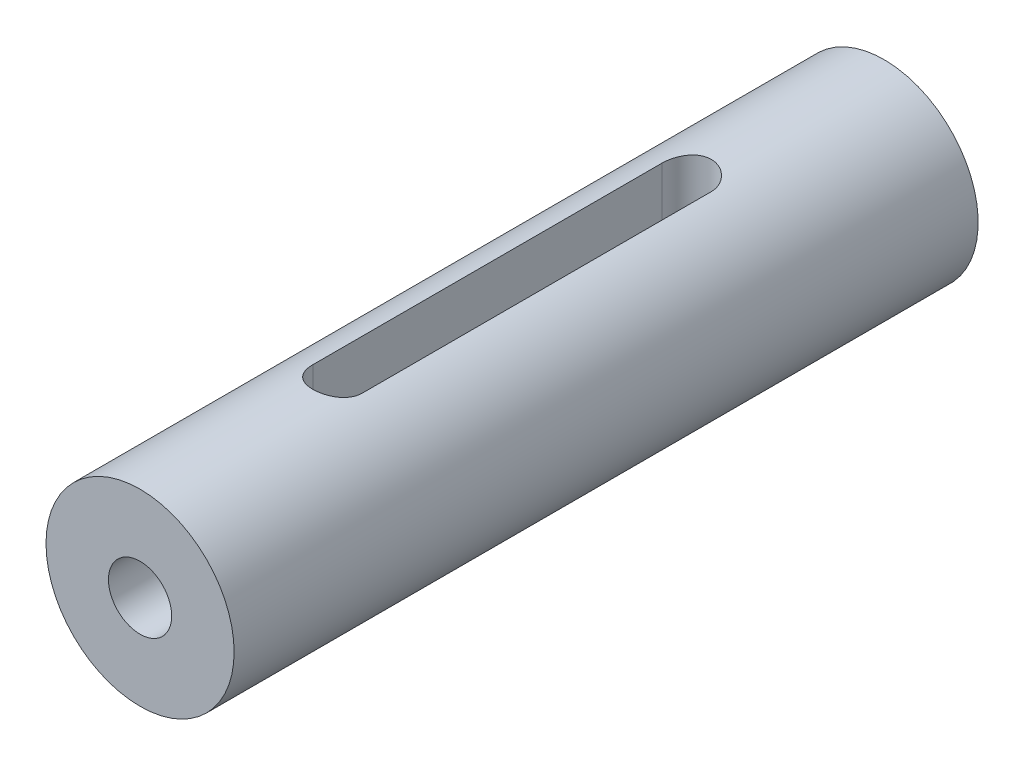
ISO-10303-21;
HEADER;
FILE_DESCRIPTION(('STEP AP214'),'2;1');
FILE_NAME('part.step','',(''),(''),'','','');
FILE_SCHEMA(('AUTOMOTIVE_DESIGN { 1 0 10303 214 1 1 1 1 }'));
ENDSEC;
DATA;
#1=APPLICATION_CONTEXT('core data for automotive mechanical design processes');
#2=APPLICATION_PROTOCOL_DEFINITION('international standard','automotive_design',2000,#1);
#3=PRODUCT_CONTEXT('',#1,'mechanical');
#4=PRODUCT('Part','Part','',(#3));
#5=PRODUCT_RELATED_PRODUCT_CATEGORY('part','',(#4));
#6=PRODUCT_DEFINITION_FORMATION('','',#4);
#7=PRODUCT_DEFINITION_CONTEXT('part definition',#1,'design');
#8=PRODUCT_DEFINITION('design','',#6,#7);
#9=PRODUCT_DEFINITION_SHAPE('','',#8);
#10=(LENGTH_UNIT() NAMED_UNIT(*) SI_UNIT(.MILLI.,.METRE.));
#11=(NAMED_UNIT(*) PLANE_ANGLE_UNIT() SI_UNIT($,.RADIAN.));
#12=(NAMED_UNIT(*) SI_UNIT($,.STERADIAN.) SOLID_ANGLE_UNIT());
#13=UNCERTAINTY_MEASURE_WITH_UNIT(LENGTH_MEASURE(1.E-05),#10,'distance_accuracy_value','');
#14=(GEOMETRIC_REPRESENTATION_CONTEXT(3) GLOBAL_UNCERTAINTY_ASSIGNED_CONTEXT((#13)) GLOBAL_UNIT_ASSIGNED_CONTEXT((#10,
#11,#12)) REPRESENTATION_CONTEXT('',''));
#15=CARTESIAN_POINT('',(0.,0.,0.));
#16=DIRECTION('',(0.,0.,1.));
#17=DIRECTION('',(1.,0.,0.));
#18=AXIS2_PLACEMENT_3D('',#15,#16,#17);
#19=CARTESIAN_POINT('',(1.25,-4.7625,8.836));
#20=DIRECTION('',(1.,0.,0.));
#21=DIRECTION('',(0.,0.,-1.));
#22=AXIS2_PLACEMENT_3D('',#19,#20,#21);
#23=PLANE('',#22);
#24=DIRECTION('',(0.,1.,0.));
#25=VECTOR('',#24,1.);
#26=CARTESIAN_POINT('',(1.25,-4.7625,8.836));
#27=LINE('',#26,#25);
#28=CARTESIAN_POINT('',(1.25,-4.5955311172921,8.836));
#29=VERTEX_POINT('',#28);
#30=CARTESIAN_POINT('',(1.25,-0.998749217771898,8.836));
#31=VERTEX_POINT('',#30);
#32=EDGE_CURVE('E109',#29,#31,#27,.T.);
#33=ORIENTED_EDGE('',*,*,#32,.T.);
#34=DIRECTION('',(0.,0.,-1.));
#35=VECTOR('',#34,1.);
#36=CARTESIAN_POINT('',(1.25,-0.998749217771898,-18.836));
#37=LINE('',#36,#35);
#38=CARTESIAN_POINT('',(1.25,-0.998749217771899,-8.836));
#39=VERTEX_POINT('',#38);
#40=EDGE_CURVE('E96',#31,#39,#37,.T.);
#41=ORIENTED_EDGE('',*,*,#40,.T.);
#42=DIRECTION('',(0.,1.,0.));
#43=VECTOR('',#42,1.);
#44=CARTESIAN_POINT('',(1.25,-4.7625,-8.836));
#45=LINE('',#44,#43);
#46=CARTESIAN_POINT('',(1.25,-4.5955311172921,-8.836));
#47=VERTEX_POINT('',#46);
#48=EDGE_CURVE('E106',#47,#39,#45,.T.);
#49=ORIENTED_EDGE('',*,*,#48,.F.);
#50=DIRECTION('',(0.,0.,-1.));
#51=VECTOR('',#50,1.);
#52=CARTESIAN_POINT('',(1.25,-4.5955311172921,22.9));
#53=LINE('',#52,#51);
#54=EDGE_CURVE('E102',#29,#47,#53,.T.);
#55=ORIENTED_EDGE('',*,*,#54,.F.);
#56=EDGE_LOOP('',(#33,#41,#49,#55));
#57=FACE_BOUND('',#56,.T.);
#58=ADVANCED_FACE('F26',(#57),#23,.F.);
#59=CARTESIAN_POINT('',(-1.25,-4.7625,8.836));
#60=DIRECTION('',(-1.,0.,0.));
#61=DIRECTION('',(0.,0.,1.));
#62=AXIS2_PLACEMENT_3D('',#59,#60,#61);
#63=PLANE('',#62);
#64=DIRECTION('',(0.,1.,0.));
#65=VECTOR('',#64,1.);
#66=CARTESIAN_POINT('',(-1.25,-4.7625,8.836));
#67=LINE('',#66,#65);
#68=CARTESIAN_POINT('',(-1.25,0.998749217771898,8.836));
#69=VERTEX_POINT('',#68);
#70=CARTESIAN_POINT('',(-1.25,4.5955311172921,8.836));
#71=VERTEX_POINT('',#70);
#72=EDGE_CURVE('E216',#69,#71,#67,.T.);
#73=ORIENTED_EDGE('',*,*,#72,.F.);
#74=DIRECTION('',(0.,0.,-1.));
#75=VECTOR('',#74,1.);
#76=CARTESIAN_POINT('',(-1.25,0.998749217771898,-18.836));
#77=LINE('',#76,#75);
#78=CARTESIAN_POINT('',(-1.25,0.998749217771897,-8.836));
#79=VERTEX_POINT('',#78);
#80=EDGE_CURVE('E223',#69,#79,#77,.T.);
#81=ORIENTED_EDGE('',*,*,#80,.T.);
#82=DIRECTION('',(0.,1.,0.));
#83=VECTOR('',#82,1.);
#84=CARTESIAN_POINT('',(-1.25,-4.7625,-8.836));
#85=LINE('',#84,#83);
#86=CARTESIAN_POINT('',(-1.25,4.5955311172921,-8.836));
#87=VERTEX_POINT('',#86);
#88=EDGE_CURVE('E115',#79,#87,#85,.T.);
#89=ORIENTED_EDGE('',*,*,#88,.T.);
#90=DIRECTION('',(0.,0.,-1.));
#91=VECTOR('',#90,1.);
#92=CARTESIAN_POINT('',(-1.25,4.5955311172921,22.9));
#93=LINE('',#92,#91);
#94=EDGE_CURVE('E202',#71,#87,#93,.T.);
#95=ORIENTED_EDGE('',*,*,#94,.F.);
#96=EDGE_LOOP('',(#73,#81,#89,#95));
#97=FACE_BOUND('',#96,.T.);
#98=ADVANCED_FACE('F220',(#97),#63,.F.);
#99=CARTESIAN_POINT('',(0.,-4.7625,8.836));
#100=DIRECTION('',(0.,1.,0.));
#101=DIRECTION('',(0.,0.,1.));
#102=AXIS2_PLACEMENT_3D('',#99,#100,#101);
#103=CYLINDRICAL_SURFACE('',#102,1.25);
#104=CARTESIAN_POINT('',(1.25,0.998749217771898,8.836));
#105=VERTEX_POINT('',#104);
#106=CARTESIAN_POINT('',(1.25,4.5955311172921,8.836));
#107=VERTEX_POINT('',#106);
#108=EDGE_CURVE('E123',#105,#107,#27,.T.);
#109=ORIENTED_EDGE('',*,*,#108,.F.);
#110=CARTESIAN_POINT('',(1.25,0.998749217771897,8.836));
#111=CARTESIAN_POINT('',(1.25000780654304,0.998726171847883,8.86496304891033));
#112=CARTESIAN_POINT('',(1.2489930260606,1.0000101714416,8.89389768223245));
#113=CARTESIAN_POINT('',(1.2449969885646,1.00498702897923,8.95134733548453));
#114=CARTESIAN_POINT('',(1.24202094875105,1.00867349576585,8.97986326404944));
#115=CARTESIAN_POINT('',(1.23038393165568,1.02288997183411,9.06358090392216));
#116=CARTESIAN_POINT('',(1.21900858653068,1.03659010536355,9.11788302098026));
#117=CARTESIAN_POINT('',(1.18654862001166,1.07369772195614,9.23489825348797));
#118=CARTESIAN_POINT('',(1.16382328878786,1.0986202349106,9.29663835521985));
#119=CARTESIAN_POINT('',(1.10995774148437,1.15302803952586,9.41455365162155));
#120=CARTESIAN_POINT('',(1.07876341057641,1.18254213369561,9.47068976909014));
#121=CARTESIAN_POINT('',(1.00772401818672,1.24368371226791,9.57847138753412));
#122=CARTESIAN_POINT('',(0.967674613821018,1.27534623523727,9.62996164501854));
#123=CARTESIAN_POINT('',(0.87975404108978,1.3375080217127,9.72638018439426));
#124=CARTESIAN_POINT('',(0.831898572309759,1.36800947155675,9.77132130133505));
#125=CARTESIAN_POINT('',(0.7308193744287,1.42446605074784,9.85206837556743));
#126=CARTESIAN_POINT('',(0.677933202977478,1.45056382719351,9.8881939238728));
#127=CARTESIAN_POINT('',(0.565580228811545,1.49793992241621,9.9526016776886));
#128=CARTESIAN_POINT('',(0.50611812390399,1.51922164906119,9.98088943247259));
#129=CARTESIAN_POINT('',(0.391282943373361,1.55238541693322,10.0245149615521));
#130=CARTESIAN_POINT('',(0.336687918611897,1.56520980294996,10.0411754317109));
#131=CARTESIAN_POINT('',(0.224743154254533,1.58515448716725,10.06696806966));
#132=CARTESIAN_POINT('',(0.167395347143884,1.59227872661413,10.0761054392669));
#133=CARTESIAN_POINT('',(0.0513643194918627,1.60023505268979,10.0863050153204));
#134=CARTESIAN_POINT('',(-0.00732242893727859,1.60104795678498,10.087342603522));
#135=CARTESIAN_POINT('',(-0.123999808013642,1.59625629374166,10.0812059079922));
#136=CARTESIAN_POINT('',(-0.181990346958659,1.59065089037779,10.0740305542169));
#137=CARTESIAN_POINT('',(-0.292928828425411,1.57391198598468,10.0524466552381));
#138=CARTESIAN_POINT('',(-0.345986079352064,1.56304341282487,10.0383844191492));
#139=CARTESIAN_POINT('',(-0.448770280586637,1.53669243561566,10.0039240692144));
#140=CARTESIAN_POINT('',(-0.498496330001685,1.52120878958219,9.9835242497688));
#141=CARTESIAN_POINT('',(-0.5988238026729,1.48477127368005,9.93478803663211));
#142=CARTESIAN_POINT('',(-0.648984669943818,1.46341746679163,9.90584933618007));
#143=CARTESIAN_POINT('',(-0.743872882254321,1.41754553972559,9.84219205162732));
#144=CARTESIAN_POINT('',(-0.788597426894621,1.39302580198859,9.80747051027006));
#145=CARTESIAN_POINT('',(-0.880955005178452,1.33693636298714,9.72536979043178));
#146=CARTESIAN_POINT('',(-0.927322129685174,1.30494849463872,9.67685322789752));
#147=CARTESIAN_POINT('',(-1.01176355268219,1.24062544996116,9.57310328266983));
#148=CARTESIAN_POINT('',(-1.04982272380755,1.20828975074609,9.51785792819272));
#149=CARTESIAN_POINT('',(-1.11209778253711,1.15097846664598,9.40961115374329));
#150=CARTESIAN_POINT('',(-1.13753349705684,1.12562609659253,9.357514194597));
#151=CARTESIAN_POINT('',(-1.18131943896127,1.07957709440595,9.24878834593405));
#152=CARTESIAN_POINT('',(-1.19971100571851,1.05885360603883,9.19218832746057));
#153=CARTESIAN_POINT('',(-1.22565251607661,1.02863929631565,9.08624426437876));
#154=CARTESIAN_POINT('',(-1.23462655119541,1.01773814990764,9.03767600506838));
#155=CARTESIAN_POINT('',(-1.24376746458511,1.00651156007992,8.96320503975249));
#156=CARTESIAN_POINT('',(-1.24609513211655,1.00362184359823,8.93793783989673));
#157=CARTESIAN_POINT('',(-1.24921512866203,0.999732016616403,8.88712003631976));
#158=CARTESIAN_POINT('',(-1.25000468754755,0.99873531551127,8.86156900446479));
#159=CARTESIAN_POINT('',(-1.25,0.99874921777191,8.836));
#160=B_SPLINE_CURVE_WITH_KNOTS('',3,(#110,#111,#112,#113,#114,#115,#116,#117,#118,#119,#120,
#121,#122,#123,#124,#125,#126,#127,#128,#129,#130,#131,#132,#133,#134,#135,#136,#137,#138,#139,
#140,#141,#142,#143,#144,#145,#146,#147,#148,#149,#150,#151,#152,#153,#154,#155,#156,#157,#158,
#159),.UNSPECIFIED.,.F.,.F.,(4,2,2,2,2,2,2,2,2,2,2,2,2,2,2,2,2,2,2,2,2,2,2,2,4),(0.,
0.0867939524704883,0.173357948905488,0.343750245069631,0.553689874249601,0.765003891740127,
0.981827449468085,1.1982201891478,1.40489587266525,1.61142485063479,1.78618384414578,
1.96082189955572,2.13599053902265,2.31118200337437,2.47835019515811,2.64556341504436,
2.8300561805009,3.0146435840726,3.23686255153719,3.45948282776756,3.64874067578436,
3.8368701734779,3.98783057373684,4.06433664327722,4.14098037307008),.UNSPECIFIED.);
#161=EDGE_CURVE('E217',#105,#69,#160,.T.);
#162=ORIENTED_EDGE('',*,*,#161,.T.);
#163=ORIENTED_EDGE('',*,*,#72,.T.);
#164=CARTESIAN_POINT('',(1.25,4.5955311172921,8.836));
#165=CARTESIAN_POINT('',(1.25000048902736,4.5955286479238,8.87051792131171));
#166=CARTESIAN_POINT('',(1.24856930329021,4.59592051769541,8.90501867495103));
#167=CARTESIAN_POINT('',(1.24286445845281,4.59746747662113,8.97376094343928));
#168=CARTESIAN_POINT('',(1.23859131440264,4.59862242748127,9.00800250412489));
#169=CARTESIAN_POINT('',(1.22157342989318,4.60318484103242,9.10981676475062));
#170=CARTESIAN_POINT('',(1.20462994333003,4.60769016639573,9.17668787737426));
#171=CARTESIAN_POINT('',(1.16010279325714,4.6191003962427,9.30650820380572));
#172=CARTESIAN_POINT('',(1.13252075573569,4.62600493401653,9.36945801523543));
#173=CARTESIAN_POINT('',(1.06753556607211,4.64143145252666,9.48987183799109));
#174=CARTESIAN_POINT('',(1.03012932683172,4.64995394144449,9.54733411719454));
#175=CARTESIAN_POINT('',(0.945599055025148,4.66788502503618,9.65649472385314));
#176=CARTESIAN_POINT('',(0.898281528189936,4.6773088498653,9.70804067799355));
#177=CARTESIAN_POINT('',(0.795683985172532,4.69584994740788,9.80256771960361));
#178=CARTESIAN_POINT('',(0.74040268420363,4.7049671703643,9.84554742241775));
#179=CARTESIAN_POINT('',(0.622389191948365,4.72203786646922,9.92235320225396));
#180=CARTESIAN_POINT('',(0.559554923009173,4.72997114379831,9.95602730939485));
#181=CARTESIAN_POINT('',(0.428877020355992,4.74360406822787,10.0122745641197));
#182=CARTESIAN_POINT('',(0.361034446460365,4.74930418629104,10.0348500526059));
#183=CARTESIAN_POINT('',(0.223862569075427,4.75772073895595,10.0677667400955));
#184=CARTESIAN_POINT('',(0.154599773236504,4.76050064256882,10.0783685807492));
#185=CARTESIAN_POINT('',(0.0152251018159465,4.76298530075748,10.0878566521175));
#186=CARTESIAN_POINT('',(-0.0548866530882436,4.76269048738806,10.0867445288612));
#187=CARTESIAN_POINT('',(-0.192153438667806,4.7591055026909,10.0730203363942));
#188=CARTESIAN_POINT('',(-0.259338850685789,4.75588872866913,10.0606900464334));
#189=CARTESIAN_POINT('',(-0.390650712032729,4.74690762656633,10.0253343048209));
#190=CARTESIAN_POINT('',(-0.454777018505625,4.74114317964122,10.0023083542346));
#191=CARTESIAN_POINT('',(-0.578877059697964,4.72760460910888,9.9459956012963));
#192=CARTESIAN_POINT('',(-0.638804334307208,4.71981148250837,9.91261116883954));
#193=CARTESIAN_POINT('',(-0.752301587943221,4.70305694044625,9.83660435046902));
#194=CARTESIAN_POINT('',(-0.805870492017475,4.69409532797514,9.79398040594682));
#195=CARTESIAN_POINT('',(-0.906807851504439,4.67566242559317,9.69921067827536));
#196=CARTESIAN_POINT('',(-0.953945243952681,4.66618390239525,9.64681995028827));
#197=CARTESIAN_POINT('',(-1.03883079398551,4.6480239902343,9.53476398651777));
#198=CARTESIAN_POINT('',(-1.0765763629283,4.63934282145884,9.47509675186921));
#199=CARTESIAN_POINT('',(-1.14177877814753,4.62373040341765,9.34968279990137));
#200=CARTESIAN_POINT('',(-1.1691688844634,4.61681059624816,9.28389994085203));
#201=CARTESIAN_POINT('',(-1.21239169501968,4.60565079860737,9.14847447317288));
#202=CARTESIAN_POINT('',(-1.2282417369292,4.60140678933727,9.07883782452349));
#203=CARTESIAN_POINT('',(-1.24203535165044,4.59769140884182,8.97982183225108));
#204=CARTESIAN_POINT('',(-1.24502243177761,4.59688266680497,8.95112141316181));
#205=CARTESIAN_POINT('',(-1.24900260644867,4.59580269375071,8.89361861339383));
#206=CARTESIAN_POINT('',(-1.24999887505704,4.59553060712194,8.864816468481));
#207=CARTESIAN_POINT('',(-1.25,4.5955311172921,8.836));
#208=B_SPLINE_CURVE_WITH_KNOTS('',3,(#164,#165,#166,#167,#168,#169,#170,#171,#172,#173,#174,
#175,#176,#177,#178,#179,#180,#181,#182,#183,#184,#185,#186,#187,#188,#189,#190,#191,#192,#193,
#194,#195,#196,#197,#198,#199,#200,#201,#202,#203,#204,#205,#206,#207),.UNSPECIFIED.,.F.,.F.,(4,
2,2,2,2,2,2,2,2,2,2,2,2,2,2,2,2,2,2,2,2,4),(0.,0.103488145890116,0.206957541660798,
0.413278033675263,0.619567004305217,0.825920875664759,1.03675855095058,1.24763027861226,
1.46176574771305,1.67585603231846,1.88519033835581,2.09449522943415,2.29868368939044,
2.50288167535393,2.7090659240344,2.91528498093169,3.12762120434211,3.34001588871634,
3.55375700257481,3.76717632768167,3.85371688959778,3.94011936451476),.UNSPECIFIED.);
#209=EDGE_CURVE('E138',#107,#71,#208,.T.);
#210=ORIENTED_EDGE('',*,*,#209,.F.);
#211=EDGE_LOOP('',(#109,#162,#163,#210));
#212=FACE_BOUND('',#211,.T.);
#213=ADVANCED_FACE('F189',(#212),#103,.F.);
#214=CARTESIAN_POINT('',(0.,-4.7625,-8.836));
#215=DIRECTION('',(0.,1.,0.));
#216=DIRECTION('',(0.,0.,1.));
#217=AXIS2_PLACEMENT_3D('',#214,#215,#216);
#218=CYLINDRICAL_SURFACE('',#217,1.25);
#219=ORIENTED_EDGE('',*,*,#88,.F.);
#220=CARTESIAN_POINT('',(-1.25,0.998749217771897,-8.836));
#221=CARTESIAN_POINT('',(-1.25000780654304,0.998726171847883,-8.86496304891033));
#222=CARTESIAN_POINT('',(-1.2489930260606,1.0000101714416,-8.89389768223245));
#223=CARTESIAN_POINT('',(-1.2449969885646,1.00498702897923,-8.95134733548453));
#224=CARTESIAN_POINT('',(-1.24202094875105,1.00867349576585,-8.97986326404944));
#225=CARTESIAN_POINT('',(-1.23038393165568,1.02288997183411,-9.06358090392216));
#226=CARTESIAN_POINT('',(-1.21900858653068,1.03659010536355,-9.11788302098026));
#227=CARTESIAN_POINT('',(-1.18654862001166,1.07369772195614,-9.23489825348797));
#228=CARTESIAN_POINT('',(-1.16382328878786,1.0986202349106,-9.29663835521985));
#229=CARTESIAN_POINT('',(-1.10995774148437,1.15302803952586,-9.41455365162155));
#230=CARTESIAN_POINT('',(-1.07876341057641,1.18254213369561,-9.47068976909014));
#231=CARTESIAN_POINT('',(-1.00772401818672,1.24368371226791,-9.57847138753412));
#232=CARTESIAN_POINT('',(-0.967674613821021,1.27534623523727,-9.62996164501854));
#233=CARTESIAN_POINT('',(-0.879754041089783,1.3375080217127,-9.72638018439426));
#234=CARTESIAN_POINT('',(-0.831898572309764,1.36800947155675,-9.77132130133505));
#235=CARTESIAN_POINT('',(-0.730819374428706,1.42446605074784,-9.85206837556743));
#236=CARTESIAN_POINT('',(-0.677933202977483,1.45056382719351,-9.88819392387279));
#237=CARTESIAN_POINT('',(-0.56558022881155,1.4979399224162,-9.9526016776886));
#238=CARTESIAN_POINT('',(-0.506118123903995,1.51922164906119,-9.98088943247259));
#239=CARTESIAN_POINT('',(-0.391282943373366,1.55238541693321,-10.0245149615521));
#240=CARTESIAN_POINT('',(-0.336687918611902,1.56520980294995,-10.0411754317109));
#241=CARTESIAN_POINT('',(-0.224743154254538,1.58515448716725,-10.06696806966));
#242=CARTESIAN_POINT('',(-0.167395347143889,1.59227872661413,-10.0761054392669));
#243=CARTESIAN_POINT('',(-0.0513643194918678,1.60023505268979,-10.0863050153204));
#244=CARTESIAN_POINT('',(0.00732242893727345,1.60104795678498,-10.087342603522));
#245=CARTESIAN_POINT('',(0.123999808013637,1.59625629374166,-10.0812059079922));
#246=CARTESIAN_POINT('',(0.181990346958655,1.5906508903778,-10.0740305542169));
#247=CARTESIAN_POINT('',(0.292928828425406,1.57391198598468,-10.0524466552381));
#248=CARTESIAN_POINT('',(0.345986079352059,1.56304341282488,-10.0383844191492));
#249=CARTESIAN_POINT('',(0.448770280586632,1.53669243561566,-10.0039240692144));
#250=CARTESIAN_POINT('',(0.498496330001681,1.5212087895822,-9.9835242497688));
#251=CARTESIAN_POINT('',(0.598823802672895,1.48477127368005,-9.93478803663211));
#252=CARTESIAN_POINT('',(0.648984669943812,1.46341746679163,-9.90584933618007));
#253=CARTESIAN_POINT('',(0.743872882254315,1.41754553972559,-9.84219205162733));
#254=CARTESIAN_POINT('',(0.788597426894617,1.39302580198859,-9.80747051027007));
#255=CARTESIAN_POINT('',(0.880955005178449,1.33693636298714,-9.7253697904318));
#256=CARTESIAN_POINT('',(0.92732212968517,1.30494849463872,-9.67685322789753));
#257=CARTESIAN_POINT('',(1.01176355268218,1.24062544996117,-9.57310328266983));
#258=CARTESIAN_POINT('',(1.04982272380755,1.20828975074609,-9.51785792819272));
#259=CARTESIAN_POINT('',(1.11209778253711,1.15097846664598,-9.40961115374329));
#260=CARTESIAN_POINT('',(1.13753349705684,1.12562609659253,-9.357514194597));
#261=CARTESIAN_POINT('',(1.18131943896126,1.07957709440595,-9.24878834593405));
#262=CARTESIAN_POINT('',(1.19971100571851,1.05885360603883,-9.19218832746057));
#263=CARTESIAN_POINT('',(1.22565251607661,1.02863929631565,-9.08624426437877));
#264=CARTESIAN_POINT('',(1.23462655119541,1.01773814990764,-9.03767600506838));
#265=CARTESIAN_POINT('',(1.24376746458511,1.00651156007992,-8.96320503975249));
#266=CARTESIAN_POINT('',(1.24609513211655,1.00362184359823,-8.93793783989673));
#267=CARTESIAN_POINT('',(1.24921512866203,0.999732016616403,-8.88712003631976));
#268=CARTESIAN_POINT('',(1.25000468754756,0.99873531551127,-8.86156900446479));
#269=CARTESIAN_POINT('',(1.25,0.99874921777191,-8.836));
#270=B_SPLINE_CURVE_WITH_KNOTS('',3,(#220,#221,#222,#223,#224,#225,#226,#227,#228,#229,#230,
#231,#232,#233,#234,#235,#236,#237,#238,#239,#240,#241,#242,#243,#244,#245,#246,#247,#248,#249,
#250,#251,#252,#253,#254,#255,#256,#257,#258,#259,#260,#261,#262,#263,#264,#265,#266,#267,#268,
#269),.UNSPECIFIED.,.F.,.F.,(4,2,2,2,2,2,2,2,2,2,2,2,2,2,2,2,2,2,2,2,2,2,2,2,4),(0.,
0.0867939524704883,0.173357948905488,0.343750245069631,0.553689874249602,0.765003891740124,
0.981827449468081,1.1982201891478,1.40489587266524,1.61142485063479,1.78618384414577,
1.96082189955571,2.13599053902264,2.31118200337436,2.47835019515811,2.64556341504436,
2.83005618050089,3.01464358407259,3.23686255153719,3.45948282776756,3.64874067578436,
3.8368701734779,3.98783057373683,4.06433664327722,4.14098037307008),.UNSPECIFIED.);
#271=CARTESIAN_POINT('',(1.25,0.998749217771897,-8.836));
#272=VERTEX_POINT('',#271);
#273=EDGE_CURVE('E13',#79,#272,#270,.T.);
#274=ORIENTED_EDGE('',*,*,#273,.T.);
#275=CARTESIAN_POINT('',(1.25,4.5955311172921,-8.836));
#276=VERTEX_POINT('',#275);
#277=EDGE_CURVE('E116',#272,#276,#45,.T.);
#278=ORIENTED_EDGE('',*,*,#277,.T.);
#279=CARTESIAN_POINT('',(-1.25,4.5955311172921,-8.836));
#280=CARTESIAN_POINT('',(-1.25000048902736,4.5955286479238,-8.87051792131171));
#281=CARTESIAN_POINT('',(-1.2485693032902,4.59592051769541,-8.90501867495103));
#282=CARTESIAN_POINT('',(-1.24286445845281,4.59746747662113,-8.97376094343928));
#283=CARTESIAN_POINT('',(-1.23859131440264,4.59862242748127,-9.00800250412489));
#284=CARTESIAN_POINT('',(-1.22157342989318,4.60318484103242,-9.10981676475062));
#285=CARTESIAN_POINT('',(-1.20462994333003,4.60769016639573,-9.17668787737426));
#286=CARTESIAN_POINT('',(-1.16010279325714,4.6191003962427,-9.30650820380572));
#287=CARTESIAN_POINT('',(-1.13252075573569,4.62600493401653,-9.36945801523544));
#288=CARTESIAN_POINT('',(-1.06753556607211,4.64143145252666,-9.4898718379911));
#289=CARTESIAN_POINT('',(-1.03012932683172,4.64995394144449,-9.54733411719455));
#290=CARTESIAN_POINT('',(-0.945599055025149,4.66788502503618,-9.65649472385315));
#291=CARTESIAN_POINT('',(-0.898281528189934,4.6773088498653,-9.70804067799355));
#292=CARTESIAN_POINT('',(-0.795683985172529,4.69584994740788,-9.80256771960361));
#293=CARTESIAN_POINT('',(-0.740402684203629,4.7049671703643,-9.84554742241775));
#294=CARTESIAN_POINT('',(-0.622389191948367,4.72203786646922,-9.92235320225396));
#295=CARTESIAN_POINT('',(-0.559554923009175,4.72997114379831,-9.95602730939485));
#296=CARTESIAN_POINT('',(-0.428877020355994,4.74360406822787,-10.0122745641197));
#297=CARTESIAN_POINT('',(-0.361034446460368,4.74930418629104,-10.0348500526059));
#298=CARTESIAN_POINT('',(-0.223862569075429,4.75772073895595,-10.0677667400955));
#299=CARTESIAN_POINT('',(-0.154599773236506,4.76050064256882,-10.0783685807492));
#300=CARTESIAN_POINT('',(-0.0152251018159477,4.76298530075748,-10.0878566521175));
#301=CARTESIAN_POINT('',(0.0548866530882426,4.76269048738806,-10.0867445288612));
#302=CARTESIAN_POINT('',(0.192153438667803,4.7591055026909,-10.0730203363943));
#303=CARTESIAN_POINT('',(0.259338850685785,4.75588872866913,-10.0606900464334));
#304=CARTESIAN_POINT('',(0.390650712032725,4.74690762656633,-10.0253343048209));
#305=CARTESIAN_POINT('',(0.454777018505623,4.74114317964122,-10.0023083542346));
#306=CARTESIAN_POINT('',(0.578877059697963,4.72760460910888,-9.9459956012963));
#307=CARTESIAN_POINT('',(0.638804334307207,4.71981148250837,-9.91261116883954));
#308=CARTESIAN_POINT('',(0.752301587943221,4.70305694044625,-9.83660435046901));
#309=CARTESIAN_POINT('',(0.805870492017475,4.69409532797514,-9.79398040594682));
#310=CARTESIAN_POINT('',(0.906807851504438,4.67566242559317,-9.69921067827536));
#311=CARTESIAN_POINT('',(0.953945243952678,4.66618390239525,-9.64681995028827));
#312=CARTESIAN_POINT('',(1.03883079398551,4.6480239902343,-9.53476398651777));
#313=CARTESIAN_POINT('',(1.0765763629283,4.63934282145884,-9.47509675186922));
#314=CARTESIAN_POINT('',(1.14177877814753,4.62373040341765,-9.34968279990138));
#315=CARTESIAN_POINT('',(1.16916888446339,4.61681059624816,-9.28389994085203));
#316=CARTESIAN_POINT('',(1.21239169501968,4.60565079860737,-9.14847447317289));
#317=CARTESIAN_POINT('',(1.2282417369292,4.60140678933727,-9.07883782452349));
#318=CARTESIAN_POINT('',(1.24203535165044,4.59769140884182,-8.97982183225109));
#319=CARTESIAN_POINT('',(1.24502243177761,4.59688266680497,-8.95112141316181));
#320=CARTESIAN_POINT('',(1.24900260644866,4.59580269375071,-8.89361861339384));
#321=CARTESIAN_POINT('',(1.24999887505704,4.59553060712194,-8.86481646848101));
#322=CARTESIAN_POINT('',(1.25,4.5955311172921,-8.836));
#323=B_SPLINE_CURVE_WITH_KNOTS('',3,(#279,#280,#281,#282,#283,#284,#285,#286,#287,#288,#289,
#290,#291,#292,#293,#294,#295,#296,#297,#298,#299,#300,#301,#302,#303,#304,#305,#306,#307,#308,
#309,#310,#311,#312,#313,#314,#315,#316,#317,#318,#319,#320,#321,#322),.UNSPECIFIED.,.F.,.F.,(4,
2,2,2,2,2,2,2,2,2,2,2,2,2,2,2,2,2,2,2,2,4),(0.,0.103488145890114,0.206957541660798,
0.413278033675263,0.619567004305222,0.825920875664768,1.03675855095059,1.24763027861226,
1.46176574771305,1.67585603231846,1.88519033835581,2.09449522943415,2.29868368939044,
2.50288167535394,2.70906592403441,2.91528498093169,3.12762120434211,3.34001588871634,
3.55375700257481,3.76717632768166,3.85371688959778,3.94011936451476),.UNSPECIFIED.);
#324=EDGE_CURVE('E131',#87,#276,#323,.T.);
#325=ORIENTED_EDGE('',*,*,#324,.F.);
#326=EDGE_LOOP('',(#219,#274,#278,#325));
#327=FACE_BOUND('',#326,.T.);
#328=ADVANCED_FACE('F151',(#327),#218,.F.);
#329=CARTESIAN_POINT('',(0.,0.,22.9));
#330=DIRECTION('',(0.,0.,-1.));
#331=DIRECTION('',(-1.,0.,0.));
#332=AXIS2_PLACEMENT_3D('',#329,#330,#331);
#333=CYLINDRICAL_SURFACE('',#332,4.7625);
#334=ORIENTED_EDGE('',*,*,#54,.T.);
#335=CARTESIAN_POINT('',(1.25,-4.5955311172921,-8.836));
#336=CARTESIAN_POINT('',(1.25000048902736,-4.5955286479238,-8.87051792131171));
#337=CARTESIAN_POINT('',(1.24856930329021,-4.59592051769541,-8.90501867495103));
#338=CARTESIAN_POINT('',(1.24286445845281,-4.59746747662113,-8.97376094343928));
#339=CARTESIAN_POINT('',(1.23859131440264,-4.59862242748127,-9.00800250412489));
#340=CARTESIAN_POINT('',(1.22157342989318,-4.60318484103242,-9.10981676475062));
#341=CARTESIAN_POINT('',(1.20462994333003,-4.60769016639573,-9.17668787737426));
#342=CARTESIAN_POINT('',(1.16010279325714,-4.6191003962427,-9.30650820380572));
#343=CARTESIAN_POINT('',(1.13252075573569,-4.62600493401653,-9.36945801523543));
#344=CARTESIAN_POINT('',(1.06753556607211,-4.64143145252666,-9.48987183799109));
#345=CARTESIAN_POINT('',(1.03012932683172,-4.64995394144449,-9.54733411719454));
#346=CARTESIAN_POINT('',(0.945599055025149,-4.66788502503618,-9.65649472385314));
#347=CARTESIAN_POINT('',(0.898281528189936,-4.6773088498653,-9.70804067799355));
#348=CARTESIAN_POINT('',(0.795683985172532,-4.69584994740788,-9.80256771960361));
#349=CARTESIAN_POINT('',(0.740402684203631,-4.7049671703643,-9.84554742241775));
#350=CARTESIAN_POINT('',(0.622389191948366,-4.72203786646922,-9.92235320225396));
#351=CARTESIAN_POINT('',(0.559554923009175,-4.72997114379831,-9.95602730939485));
#352=CARTESIAN_POINT('',(0.428877020355994,-4.74360406822787,-10.0122745641197));
#353=CARTESIAN_POINT('',(0.361034446460368,-4.74930418629104,-10.0348500526059));
#354=CARTESIAN_POINT('',(0.22386256907543,-4.75772073895595,-10.0677667400955));
#355=CARTESIAN_POINT('',(0.154599773236507,-4.76050064256882,-10.0783685807492));
#356=CARTESIAN_POINT('',(0.0152251018159492,-4.76298530075748,-10.0878566521175));
#357=CARTESIAN_POINT('',(-0.0548866530882412,-4.76269048738806,-10.0867445288612));
#358=CARTESIAN_POINT('',(-0.192153438667801,-4.7591055026909,-10.0730203363943));
#359=CARTESIAN_POINT('',(-0.259338850685782,-4.75588872866913,-10.0606900464334));
#360=CARTESIAN_POINT('',(-0.390650712032722,-4.74690762656633,-10.0253343048209));
#361=CARTESIAN_POINT('',(-0.454777018505622,-4.74114317964122,-10.0023083542346));
#362=CARTESIAN_POINT('',(-0.578877059697962,-4.72760460910888,-9.94599560129631));
#363=CARTESIAN_POINT('',(-0.638804334307204,-4.71981148250837,-9.91261116883955));
#364=CARTESIAN_POINT('',(-0.752301587943217,-4.70305694044625,-9.83660435046901));
#365=CARTESIAN_POINT('',(-0.805870492017472,-4.69409532797514,-9.79398040594682));
#366=CARTESIAN_POINT('',(-0.906807851504437,-4.67566242559317,-9.69921067827536));
#367=CARTESIAN_POINT('',(-0.953945243952678,-4.66618390239525,-9.64681995028827));
#368=CARTESIAN_POINT('',(-1.03883079398551,-4.6480239902343,-9.53476398651777));
#369=CARTESIAN_POINT('',(-1.0765763629283,-4.63934282145884,-9.47509675186922));
#370=CARTESIAN_POINT('',(-1.14177877814753,-4.62373040341765,-9.34968279990138));
#371=CARTESIAN_POINT('',(-1.16916888446339,-4.61681059624816,-9.28389994085203));
#372=CARTESIAN_POINT('',(-1.21239169501968,-4.60565079860737,-9.14847447317289));
#373=CARTESIAN_POINT('',(-1.22824173692919,-4.60140678933727,-9.07883782452349));
#374=CARTESIAN_POINT('',(-1.24203535165044,-4.59769140884182,-8.97982183225109));
#375=CARTESIAN_POINT('',(-1.2450224317776,-4.59688266680497,-8.95112141316181));
#376=CARTESIAN_POINT('',(-1.24900260644867,-4.59580269375071,-8.89361861339384));
#377=CARTESIAN_POINT('',(-1.24999887505704,-4.59553060712194,-8.86481646848101));
#378=CARTESIAN_POINT('',(-1.25,-4.5955311172921,-8.836));
#379=B_SPLINE_CURVE_WITH_KNOTS('',3,(#335,#336,#337,#338,#339,#340,#341,#342,#343,#344,#345,
#346,#347,#348,#349,#350,#351,#352,#353,#354,#355,#356,#357,#358,#359,#360,#361,#362,#363,#364,
#365,#366,#367,#368,#369,#370,#371,#372,#373,#374,#375,#376,#377,#378),.UNSPECIFIED.,.F.,.F.,(4,
2,2,2,2,2,2,2,2,2,2,2,2,2,2,2,2,2,2,2,2,4),(0.,0.103488145890116,0.206957541660798,
0.413278033675263,0.619567004305217,0.825920875664758,1.03675855095058,1.24763027861226,
1.46176574771305,1.67585603231846,1.88519033835581,2.09449522943415,2.29868368939044,
2.50288167535393,2.70906592403441,2.91528498093169,3.12762120434211,3.34001588871634,
3.55375700257481,3.76717632768166,3.85371688959778,3.94011936451476),.UNSPECIFIED.);
#380=CARTESIAN_POINT('',(-1.25,-4.5955311172921,-8.836));
#381=VERTEX_POINT('',#380);
#382=EDGE_CURVE('E114',#47,#381,#379,.T.);
#383=ORIENTED_EDGE('',*,*,#382,.T.);
#384=DIRECTION('',(0.,0.,-1.));
#385=VECTOR('',#384,1.);
#386=CARTESIAN_POINT('',(-1.25,-4.5955311172921,22.9));
#387=LINE('',#386,#385);
#388=CARTESIAN_POINT('',(-1.25,-4.5955311172921,8.836));
#389=VERTEX_POINT('',#388);
#390=EDGE_CURVE('E199',#381,#389,#387,.F.);
#391=ORIENTED_EDGE('',*,*,#390,.T.);
#392=CARTESIAN_POINT('',(-1.25,-4.5955311172921,8.836));
#393=CARTESIAN_POINT('',(-1.25000048902736,-4.5955286479238,8.87051792131171));
#394=CARTESIAN_POINT('',(-1.24856930329021,-4.59592051769541,8.90501867495103));
#395=CARTESIAN_POINT('',(-1.24286445845281,-4.59746747662113,8.97376094343928));
#396=CARTESIAN_POINT('',(-1.23859131440264,-4.59862242748127,9.00800250412489));
#397=CARTESIAN_POINT('',(-1.22157342989318,-4.60318484103242,9.10981676475062));
#398=CARTESIAN_POINT('',(-1.20462994333003,-4.60769016639573,9.17668787737426));
#399=CARTESIAN_POINT('',(-1.16010279325714,-4.6191003962427,9.30650820380572));
#400=CARTESIAN_POINT('',(-1.13252075573569,-4.62600493401653,9.36945801523543));
#401=CARTESIAN_POINT('',(-1.06753556607211,-4.64143145252666,9.48987183799109));
#402=CARTESIAN_POINT('',(-1.03012932683172,-4.64995394144449,9.54733411719454));
#403=CARTESIAN_POINT('',(-0.945599055025148,-4.66788502503618,9.65649472385314));
#404=CARTESIAN_POINT('',(-0.898281528189937,-4.6773088498653,9.70804067799355));
#405=CARTESIAN_POINT('',(-0.795683985172532,-4.69584994740788,9.80256771960361));
#406=CARTESIAN_POINT('',(-0.740402684203629,-4.7049671703643,9.84554742241775));
#407=CARTESIAN_POINT('',(-0.622389191948364,-4.72203786646922,9.92235320225396));
#408=CARTESIAN_POINT('',(-0.559554923009172,-4.72997114379831,9.95602730939485));
#409=CARTESIAN_POINT('',(-0.428877020355991,-4.74360406822787,10.0122745641197));
#410=CARTESIAN_POINT('',(-0.361034446460365,-4.74930418629104,10.0348500526059));
#411=CARTESIAN_POINT('',(-0.223862569075426,-4.75772073895595,10.0677667400955));
#412=CARTESIAN_POINT('',(-0.154599773236503,-4.76050064256882,10.0783685807492));
#413=CARTESIAN_POINT('',(-0.0152251018159459,-4.76298530075748,10.0878566521175));
#414=CARTESIAN_POINT('',(0.0548866530882441,-4.76269048738806,10.0867445288612));
#415=CARTESIAN_POINT('',(0.192153438667806,-4.7591055026909,10.0730203363942));
#416=CARTESIAN_POINT('',(0.25933885068579,-4.75588872866913,10.0606900464334));
#417=CARTESIAN_POINT('',(0.390650712032729,-4.74690762656633,10.0253343048209));
#418=CARTESIAN_POINT('',(0.454777018505625,-4.74114317964122,10.0023083542346));
#419=CARTESIAN_POINT('',(0.578877059697964,-4.72760460910888,9.9459956012963));
#420=CARTESIAN_POINT('',(0.638804334307207,-4.71981148250837,9.91261116883954));
#421=CARTESIAN_POINT('',(0.752301587943221,-4.70305694044625,9.83660435046902));
#422=CARTESIAN_POINT('',(0.805870492017475,-4.69409532797514,9.79398040594682));
#423=CARTESIAN_POINT('',(0.906807851504438,-4.67566242559317,9.69921067827536));
#424=CARTESIAN_POINT('',(0.953945243952678,-4.66618390239525,9.64681995028827));
#425=CARTESIAN_POINT('',(1.03883079398551,-4.6480239902343,9.53476398651777));
#426=CARTESIAN_POINT('',(1.0765763629283,-4.63934282145884,9.47509675186922));
#427=CARTESIAN_POINT('',(1.14177877814753,-4.62373040341765,9.34968279990138));
#428=CARTESIAN_POINT('',(1.16916888446339,-4.61681059624816,9.28389994085203));
#429=CARTESIAN_POINT('',(1.21239169501968,-4.60565079860737,9.14847447317289));
#430=CARTESIAN_POINT('',(1.2282417369292,-4.60140678933727,9.07883782452349));
#431=CARTESIAN_POINT('',(1.24203535165044,-4.59769140884182,8.97982183225108));
#432=CARTESIAN_POINT('',(1.24502243177761,-4.59688266680497,8.95112141316181));
#433=CARTESIAN_POINT('',(1.24900260644867,-4.59580269375071,8.89361861339383));
#434=CARTESIAN_POINT('',(1.24999887505704,-4.59553060712194,8.864816468481));
#435=CARTESIAN_POINT('',(1.25,-4.5955311172921,8.836));
#436=B_SPLINE_CURVE_WITH_KNOTS('',3,(#392,#393,#394,#395,#396,#397,#398,#399,#400,#401,#402,
#403,#404,#405,#406,#407,#408,#409,#410,#411,#412,#413,#414,#415,#416,#417,#418,#419,#420,#421,
#422,#423,#424,#425,#426,#427,#428,#429,#430,#431,#432,#433,#434,#435),.UNSPECIFIED.,.F.,.F.,(4,
2,2,2,2,2,2,2,2,2,2,2,2,2,2,2,2,2,2,2,2,4),(0.,0.103488145890116,0.206957541660798,
0.413278033675263,0.619567004305217,0.825920875664759,1.03675855095058,1.24763027861226,
1.46176574771305,1.67585603231846,1.88519033835581,2.09449522943415,2.29868368939044,
2.50288167535393,2.7090659240344,2.91528498093169,3.12762120434211,3.34001588871633,
3.55375700257481,3.76717632768167,3.85371688959778,3.94011936451476),.UNSPECIFIED.);
#437=EDGE_CURVE('E193',#389,#29,#436,.T.);
#438=ORIENTED_EDGE('',*,*,#437,.T.);
#439=EDGE_LOOP('',(#334,#383,#391,#438));
#440=FACE_BOUND('',#439,.T.);
#441=ORIENTED_EDGE('',*,*,#94,.T.);
#442=ORIENTED_EDGE('',*,*,#324,.T.);
#443=DIRECTION('',(0.,0.,-1.));
#444=VECTOR('',#443,1.);
#445=CARTESIAN_POINT('',(1.25,4.5955311172921,22.9));
#446=LINE('',#445,#444);
#447=EDGE_CURVE('E204',#276,#107,#446,.F.);
#448=ORIENTED_EDGE('',*,*,#447,.T.);
#449=ORIENTED_EDGE('',*,*,#209,.T.);
#450=EDGE_LOOP('',(#441,#442,#448,#449));
#451=FACE_BOUND('',#450,.T.);
#452=CARTESIAN_POINT('',(0.,0.,-18.836));
#453=DIRECTION('',(0.,0.,-1.));
#454=DIRECTION('',(-1.,0.,0.));
#455=AXIS2_PLACEMENT_3D('',#452,#453,#454);
#456=CIRCLE('',#455,4.7625);
#457=CARTESIAN_POINT('',(-4.7625,0.,-18.836));
#458=VERTEX_POINT('',#457);
#459=EDGE_CURVE('E127',#458,#458,#456,.T.);
#460=ORIENTED_EDGE('',*,*,#459,.F.);
#461=EDGE_LOOP('',(#460));
#462=FACE_BOUND('',#461,.T.);
#463=CARTESIAN_POINT('',(0.,0.,18.836));
#464=DIRECTION('',(0.,0.,1.));
#465=DIRECTION('',(1.,0.,0.));
#466=AXIS2_PLACEMENT_3D('',#463,#464,#465);
#467=CIRCLE('',#466,4.7625);
#468=CARTESIAN_POINT('',(4.7625,0.,18.836));
#469=VERTEX_POINT('',#468);
#470=EDGE_CURVE('E124',#469,#469,#467,.T.);
#471=ORIENTED_EDGE('',*,*,#470,.F.);
#472=EDGE_LOOP('',(#471));
#473=FACE_BOUND('',#472,.T.);
#474=ADVANCED_FACE('F28',(#440,#451,#462,#473),#333,.T.);
#475=CARTESIAN_POINT('',(0.,0.,-18.836));
#476=DIRECTION('',(0.,0.,-1.));
#477=DIRECTION('',(-1.,0.,0.));
#478=AXIS2_PLACEMENT_3D('',#475,#476,#477);
#479=PLANE('',#478);
#480=CARTESIAN_POINT('',(0.,0.,-18.836));
#481=DIRECTION('',(0.,0.,-1.));
#482=DIRECTION('',(-1.,0.,0.));
#483=AXIS2_PLACEMENT_3D('',#480,#481,#482);
#484=CIRCLE('',#483,1.6);
#485=CARTESIAN_POINT('',(-1.6,0.,-18.836));
#486=VERTEX_POINT('',#485);
#487=EDGE_CURVE('E236',#486,#486,#484,.T.);
#488=ORIENTED_EDGE('',*,*,#487,.F.);
#489=EDGE_LOOP('',(#488));
#490=FACE_BOUND('',#489,.T.);
#491=ORIENTED_EDGE('',*,*,#459,.T.);
#492=EDGE_LOOP('',(#491));
#493=FACE_BOUND('',#492,.T.);
#494=ADVANCED_FACE('F243',(#490,#493),#479,.T.);
#495=CARTESIAN_POINT('',(0.,0.,18.836));
#496=DIRECTION('',(0.,0.,1.));
#497=DIRECTION('',(1.,0.,0.));
#498=AXIS2_PLACEMENT_3D('',#495,#496,#497);
#499=PLANE('',#498);
#500=CARTESIAN_POINT('',(0.,0.,18.836));
#501=DIRECTION('',(0.,0.,-1.));
#502=DIRECTION('',(-1.,0.,0.));
#503=AXIS2_PLACEMENT_3D('',#500,#501,#502);
#504=CIRCLE('',#503,1.6);
#505=CARTESIAN_POINT('',(-1.6,0.,18.836));
#506=VERTEX_POINT('',#505);
#507=EDGE_CURVE('E234',#506,#506,#504,.T.);
#508=ORIENTED_EDGE('',*,*,#507,.T.);
#509=EDGE_LOOP('',(#508));
#510=FACE_BOUND('',#509,.T.);
#511=ORIENTED_EDGE('',*,*,#470,.T.);
#512=EDGE_LOOP('',(#511));
#513=FACE_BOUND('',#512,.T.);
#514=ADVANCED_FACE('F187',(#510,#513),#499,.T.);
#515=CARTESIAN_POINT('',(-1.25,-0.998749217771898,8.836));
#516=VERTEX_POINT('',#515);
#517=EDGE_CURVE('E128',#389,#516,#67,.T.);
#518=ORIENTED_EDGE('',*,*,#517,.T.);
#519=CARTESIAN_POINT('',(-1.25,-0.998749217771899,8.836));
#520=CARTESIAN_POINT('',(-1.25000780654304,-0.998726171847883,8.86496304891033));
#521=CARTESIAN_POINT('',(-1.2489930260606,-1.0000101714416,8.89389768223245));
#522=CARTESIAN_POINT('',(-1.2449969885646,-1.00498702897923,8.95134733548453));
#523=CARTESIAN_POINT('',(-1.24202094875105,-1.00867349576585,8.97986326404944));
#524=CARTESIAN_POINT('',(-1.23038393165568,-1.02288997183411,9.06358090392216));
#525=CARTESIAN_POINT('',(-1.21900858653068,-1.03659010536356,9.11788302098026));
#526=CARTESIAN_POINT('',(-1.18654862001166,-1.07369772195614,9.23489825348797));
#527=CARTESIAN_POINT('',(-1.16382328878786,-1.0986202349106,9.29663835521985));
#528=CARTESIAN_POINT('',(-1.10995774148437,-1.15302803952586,9.41455365162155));
#529=CARTESIAN_POINT('',(-1.07876341057641,-1.18254213369561,9.47068976909014));
#530=CARTESIAN_POINT('',(-1.00772401818672,-1.24368371226791,9.57847138753412));
#531=CARTESIAN_POINT('',(-0.967674613821018,-1.27534623523727,9.62996164501854));
#532=CARTESIAN_POINT('',(-0.87975404108978,-1.3375080217127,9.72638018439426));
#533=CARTESIAN_POINT('',(-0.831898572309759,-1.36800947155675,9.77132130133505));
#534=CARTESIAN_POINT('',(-0.7308193744287,-1.42446605074784,9.85206837556743));
#535=CARTESIAN_POINT('',(-0.677933202977478,-1.45056382719351,9.8881939238728));
#536=CARTESIAN_POINT('',(-0.565580228811546,-1.49793992241621,9.9526016776886));
#537=CARTESIAN_POINT('',(-0.506118123903991,-1.51922164906119,9.98088943247259));
#538=CARTESIAN_POINT('',(-0.391282943373362,-1.55238541693322,10.0245149615521));
#539=CARTESIAN_POINT('',(-0.336687918611898,-1.56520980294996,10.0411754317109));
#540=CARTESIAN_POINT('',(-0.224743154254534,-1.58515448716725,10.06696806966));
#541=CARTESIAN_POINT('',(-0.167395347143885,-1.59227872661413,10.0761054392669));
#542=CARTESIAN_POINT('',(-0.0513643194918639,-1.60023505268979,10.0863050153204));
#543=CARTESIAN_POINT('',(0.00732242893727746,-1.60104795678498,10.087342603522));
#544=CARTESIAN_POINT('',(0.123999808013641,-1.59625629374166,10.0812059079922));
#545=CARTESIAN_POINT('',(0.181990346958658,-1.59065089037779,10.0740305542169));
#546=CARTESIAN_POINT('',(0.292928828425409,-1.57391198598468,10.0524466552381));
#547=CARTESIAN_POINT('',(0.345986079352063,-1.56304341282488,10.0383844191492));
#548=CARTESIAN_POINT('',(0.448770280586635,-1.53669243561566,10.0039240692144));
#549=CARTESIAN_POINT('',(0.498496330001683,-1.52120878958219,9.9835242497688));
#550=CARTESIAN_POINT('',(0.598823802672898,-1.48477127368005,9.93478803663211));
#551=CARTESIAN_POINT('',(0.648984669943816,-1.46341746679163,9.90584933618007));
#552=CARTESIAN_POINT('',(0.74387288225432,-1.41754553972559,9.84219205162732));
#553=CARTESIAN_POINT('',(0.788597426894619,-1.39302580198859,9.80747051027006));
#554=CARTESIAN_POINT('',(0.88095500517845,-1.33693636298714,9.72536979043178));
#555=CARTESIAN_POINT('',(0.927322129685173,-1.30494849463872,9.67685322789752));
#556=CARTESIAN_POINT('',(1.01176355268219,-1.24062544996116,9.57310328266983));
#557=CARTESIAN_POINT('',(1.04982272380755,-1.20828975074609,9.51785792819272));
#558=CARTESIAN_POINT('',(1.11209778253711,-1.15097846664598,9.40961115374329));
#559=CARTESIAN_POINT('',(1.13753349705684,-1.12562609659253,9.357514194597));
#560=CARTESIAN_POINT('',(1.18131943896127,-1.07957709440595,9.24878834593405));
#561=CARTESIAN_POINT('',(1.19971100571851,-1.05885360603883,9.19218832746057));
#562=CARTESIAN_POINT('',(1.22565251607661,-1.02863929631565,9.08624426437876));
#563=CARTESIAN_POINT('',(1.23462655119541,-1.01773814990764,9.03767600506838));
#564=CARTESIAN_POINT('',(1.24376746458511,-1.00651156007992,8.96320503975249));
#565=CARTESIAN_POINT('',(1.24609513211655,-1.00362184359823,8.93793783989673));
#566=CARTESIAN_POINT('',(1.24921512866203,-0.999732016616403,8.88712003631976));
#567=CARTESIAN_POINT('',(1.25000468754755,-0.99873531551127,8.86156900446479));
#568=CARTESIAN_POINT('',(1.25,-0.99874921777191,8.836));
#569=B_SPLINE_CURVE_WITH_KNOTS('',3,(#519,#520,#521,#522,#523,#524,#525,#526,#527,#528,#529,
#530,#531,#532,#533,#534,#535,#536,#537,#538,#539,#540,#541,#542,#543,#544,#545,#546,#547,#548,
#549,#550,#551,#552,#553,#554,#555,#556,#557,#558,#559,#560,#561,#562,#563,#564,#565,#566,#567,
#568),.UNSPECIFIED.,.F.,.F.,(4,2,2,2,2,2,2,2,2,2,2,2,2,2,2,2,2,2,2,2,2,2,2,2,4),(0.,
0.0867939524704882,0.173357948905488,0.343750245069632,0.553689874249601,0.765003891740127,
0.981827449468085,1.1982201891478,1.40489587266525,1.61142485063479,1.78618384414578,
1.96082189955572,2.13599053902265,2.31118200337437,2.47835019515811,2.64556341504436,
2.8300561805009,3.0146435840726,3.23686255153719,3.45948282776756,3.64874067578436,
3.8368701734779,3.98783057373684,4.06433664327722,4.14098037307008),.UNSPECIFIED.);
#570=EDGE_CURVE('E110',#516,#31,#569,.T.);
#571=ORIENTED_EDGE('',*,*,#570,.T.);
#572=ORIENTED_EDGE('',*,*,#32,.F.);
#573=ORIENTED_EDGE('',*,*,#437,.F.);
#574=EDGE_LOOP('',(#518,#571,#572,#573));
#575=FACE_BOUND('',#574,.T.);
#576=ADVANCED_FACE('F183',(#575),#103,.F.);
#577=CARTESIAN_POINT('',(-1.25,-0.998749217771898,-8.836));
#578=VERTEX_POINT('',#577);
#579=EDGE_CURVE('E118',#381,#578,#85,.T.);
#580=ORIENTED_EDGE('',*,*,#579,.T.);
#581=DIRECTION('',(0.,0.,-1.));
#582=VECTOR('',#581,1.);
#583=CARTESIAN_POINT('',(-1.25,-0.998749217771898,-18.836));
#584=LINE('',#583,#582);
#585=EDGE_CURVE('E55',#578,#516,#584,.F.);
#586=ORIENTED_EDGE('',*,*,#585,.T.);
#587=ORIENTED_EDGE('',*,*,#517,.F.);
#588=ORIENTED_EDGE('',*,*,#390,.F.);
#589=EDGE_LOOP('',(#580,#586,#587,#588));
#590=FACE_BOUND('',#589,.T.);
#591=ADVANCED_FACE('F150',(#590),#63,.F.);
#592=ORIENTED_EDGE('',*,*,#48,.T.);
#593=CARTESIAN_POINT('',(1.25,-0.998749217771899,-8.836));
#594=CARTESIAN_POINT('',(1.25000780654303,-0.998726171847884,-8.86496304891033));
#595=CARTESIAN_POINT('',(1.2489930260606,-1.0000101714416,-8.89389768223245));
#596=CARTESIAN_POINT('',(1.2449969885646,-1.00498702897922,-8.95134733548453));
#597=CARTESIAN_POINT('',(1.24202094875105,-1.00867349576584,-8.97986326404944));
#598=CARTESIAN_POINT('',(1.23038393165568,-1.02288997183411,-9.06358090392216));
#599=CARTESIAN_POINT('',(1.21900858653068,-1.03659010536355,-9.11788302098025));
#600=CARTESIAN_POINT('',(1.18654862001166,-1.07369772195613,-9.23489825348796));
#601=CARTESIAN_POINT('',(1.16382328878786,-1.0986202349106,-9.29663835521984));
#602=CARTESIAN_POINT('',(1.10995774148437,-1.15302803952585,-9.41455365162155));
#603=CARTESIAN_POINT('',(1.07876341057642,-1.18254213369561,-9.47068976909014));
#604=CARTESIAN_POINT('',(1.00772401818672,-1.24368371226791,-9.57847138753412));
#605=CARTESIAN_POINT('',(0.967674613821021,-1.27534623523727,-9.62996164501854));
#606=CARTESIAN_POINT('',(0.879754041089784,-1.3375080217127,-9.72638018439426));
#607=CARTESIAN_POINT('',(0.831898572309766,-1.36800947155674,-9.77132130133505));
#608=CARTESIAN_POINT('',(0.730819374428708,-1.42446605074783,-9.85206837556743));
#609=CARTESIAN_POINT('',(0.677933202977485,-1.45056382719351,-9.88819392387279));
#610=CARTESIAN_POINT('',(0.565580228811552,-1.4979399224162,-9.95260167768859));
#611=CARTESIAN_POINT('',(0.506118123903998,-1.51922164906119,-9.98088943247259));
#612=CARTESIAN_POINT('',(0.391282943373369,-1.55238541693321,-10.0245149615521));
#613=CARTESIAN_POINT('',(0.336687918611905,-1.56520980294995,-10.0411754317109));
#614=CARTESIAN_POINT('',(0.224743154254541,-1.58515448716725,-10.06696806966));
#615=CARTESIAN_POINT('',(0.167395347143892,-1.59227872661413,-10.0761054392669));
#616=CARTESIAN_POINT('',(0.0513643194918712,-1.60023505268979,-10.0863050153204));
#617=CARTESIAN_POINT('',(-0.0073224289372701,-1.60104795678498,-10.087342603522));
#618=CARTESIAN_POINT('',(-0.123999808013634,-1.59625629374166,-10.0812059079922));
#619=CARTESIAN_POINT('',(-0.181990346958651,-1.5906508903778,-10.0740305542169));
#620=CARTESIAN_POINT('',(-0.292928828425403,-1.57391198598468,-10.0524466552381));
#621=CARTESIAN_POINT('',(-0.345986079352057,-1.56304341282488,-10.0383844191492));
#622=CARTESIAN_POINT('',(-0.44877028058663,-1.53669243561566,-10.0039240692144));
#623=CARTESIAN_POINT('',(-0.498496330001678,-1.5212087895822,-9.9835242497688));
#624=CARTESIAN_POINT('',(-0.598823802672892,-1.48477127368005,-9.93478803663211));
#625=CARTESIAN_POINT('',(-0.648984669943809,-1.46341746679163,-9.90584933618008));
#626=CARTESIAN_POINT('',(-0.743872882254313,-1.4175455397256,-9.84219205162733));
#627=CARTESIAN_POINT('',(-0.788597426894614,-1.39302580198859,-9.80747051027007));
#628=CARTESIAN_POINT('',(-0.880955005178445,-1.33693636298715,-9.7253697904318));
#629=CARTESIAN_POINT('',(-0.927322129685167,-1.30494849463873,-9.67685322789753));
#630=CARTESIAN_POINT('',(-1.01176355268218,-1.24062544996117,-9.57310328266983));
#631=CARTESIAN_POINT('',(-1.04982272380754,-1.20828975074609,-9.51785792819273));
#632=CARTESIAN_POINT('',(-1.11209778253711,-1.15097846664598,-9.4096111537433));
#633=CARTESIAN_POINT('',(-1.13753349705684,-1.12562609659253,-9.35751419459701));
#634=CARTESIAN_POINT('',(-1.18131943896126,-1.07957709440595,-9.24878834593405));
#635=CARTESIAN_POINT('',(-1.19971100571851,-1.05885360603883,-9.19218832746057));
#636=CARTESIAN_POINT('',(-1.2256525160766,-1.02863929631565,-9.08624426437877));
#637=CARTESIAN_POINT('',(-1.23462655119541,-1.01773814990764,-9.03767600506838));
#638=CARTESIAN_POINT('',(-1.24376746458511,-1.00651156007992,-8.9632050397525));
#639=CARTESIAN_POINT('',(-1.24609513211655,-1.00362184359823,-8.93793783989673));
#640=CARTESIAN_POINT('',(-1.24921512866203,-0.999732016616403,-8.88712003631976));
#641=CARTESIAN_POINT('',(-1.25000468754755,-0.99873531551127,-8.86156900446479));
#642=CARTESIAN_POINT('',(-1.25,-0.99874921777191,-8.836));
#643=B_SPLINE_CURVE_WITH_KNOTS('',3,(#593,#594,#595,#596,#597,#598,#599,#600,#601,#602,#603,
#604,#605,#606,#607,#608,#609,#610,#611,#612,#613,#614,#615,#616,#617,#618,#619,#620,#621,#622,
#623,#624,#625,#626,#627,#628,#629,#630,#631,#632,#633,#634,#635,#636,#637,#638,#639,#640,#641,
#642),.UNSPECIFIED.,.F.,.F.,(4,2,2,2,2,2,2,2,2,2,2,2,2,2,2,2,2,2,2,2,2,2,2,2,4),(0.,
0.0867939524704882,0.173357948905484,0.343750245069621,0.553689874249592,0.765003891740123,
0.98182744946808,1.1982201891478,1.40489587266524,1.61142485063479,1.78618384414577,
1.96082189955571,2.13599053902264,2.31118200337436,2.4783501951581,2.64556341504435,
2.83005618050089,3.01464358407259,3.23686255153718,3.45948282776754,3.64874067578435,
3.83687017347789,3.98783057373683,4.06433664327722,4.14098037307008),.UNSPECIFIED.);
#644=EDGE_CURVE('E41',#39,#578,#643,.T.);
#645=ORIENTED_EDGE('',*,*,#644,.T.);
#646=ORIENTED_EDGE('',*,*,#579,.F.);
#647=ORIENTED_EDGE('',*,*,#382,.F.);
#648=EDGE_LOOP('',(#592,#645,#646,#647));
#649=FACE_BOUND('',#648,.T.);
#650=ADVANCED_FACE('F112',(#649),#218,.F.);
#651=ORIENTED_EDGE('',*,*,#277,.F.);
#652=DIRECTION('',(0.,0.,-1.));
#653=VECTOR('',#652,1.);
#654=CARTESIAN_POINT('',(1.25,0.998749217771898,-18.836));
#655=LINE('',#654,#653);
#656=EDGE_CURVE('E48',#272,#105,#655,.F.);
#657=ORIENTED_EDGE('',*,*,#656,.T.);
#658=ORIENTED_EDGE('',*,*,#108,.T.);
#659=ORIENTED_EDGE('',*,*,#447,.F.);
#660=EDGE_LOOP('',(#651,#657,#658,#659));
#661=FACE_BOUND('',#660,.T.);
#662=ADVANCED_FACE('F149',(#661),#23,.F.);
#663=CARTESIAN_POINT('',(0.,0.,-18.836));
#664=DIRECTION('',(0.,0.,-1.));
#665=DIRECTION('',(-1.,0.,0.));
#666=AXIS2_PLACEMENT_3D('',#663,#664,#665);
#667=CYLINDRICAL_SURFACE('',#666,1.6);
#668=ORIENTED_EDGE('',*,*,#507,.F.);
#669=EDGE_LOOP('',(#668));
#670=FACE_BOUND('',#669,.T.);
#671=ORIENTED_EDGE('',*,*,#487,.T.);
#672=EDGE_LOOP('',(#671));
#673=FACE_BOUND('',#672,.T.);
#674=ORIENTED_EDGE('',*,*,#585,.F.);
#675=ORIENTED_EDGE('',*,*,#644,.F.);
#676=ORIENTED_EDGE('',*,*,#40,.F.);
#677=ORIENTED_EDGE('',*,*,#570,.F.);
#678=EDGE_LOOP('',(#674,#675,#676,#677));
#679=FACE_BOUND('',#678,.T.);
#680=ORIENTED_EDGE('',*,*,#656,.F.);
#681=ORIENTED_EDGE('',*,*,#273,.F.);
#682=ORIENTED_EDGE('',*,*,#80,.F.);
#683=ORIENTED_EDGE('',*,*,#161,.F.);
#684=EDGE_LOOP('',(#680,#681,#682,#683));
#685=FACE_BOUND('',#684,.T.);
#686=ADVANCED_FACE('F95',(#670,#673,#679,#685),#667,.F.);
#687=CLOSED_SHELL('',(#58,#98,#213,#328,#474,#494,#514,#576,#591,#650,#662,#686));
#688=MANIFOLD_SOLID_BREP('B1',#687);
#689=ADVANCED_BREP_SHAPE_REPRESENTATION('',(#18,#688),#14);
#690=SHAPE_DEFINITION_REPRESENTATION(#9,#689);
ENDSEC;
END-ISO-10303-21;
